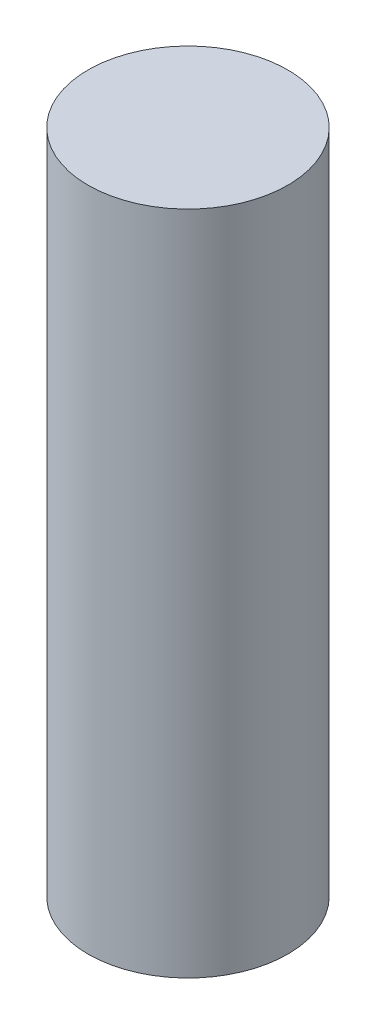
ISO-10303-21;
HEADER;
FILE_DESCRIPTION(('STEP AP214'),'2;1');
FILE_NAME('part.step','',(''),(''),'','','');
FILE_SCHEMA(('AUTOMOTIVE_DESIGN { 1 0 10303 214 1 1 1 1 }'));
ENDSEC;
DATA;
#1=APPLICATION_CONTEXT('core data for automotive mechanical design processes');
#2=APPLICATION_PROTOCOL_DEFINITION('international standard','automotive_design',2000,#1);
#3=PRODUCT_CONTEXT('',#1,'mechanical');
#4=PRODUCT('Part','Part','',(#3));
#5=PRODUCT_RELATED_PRODUCT_CATEGORY('part','',(#4));
#6=PRODUCT_DEFINITION_FORMATION('','',#4);
#7=PRODUCT_DEFINITION_CONTEXT('part definition',#1,'design');
#8=PRODUCT_DEFINITION('design','',#6,#7);
#9=PRODUCT_DEFINITION_SHAPE('','',#8);
#10=(LENGTH_UNIT() NAMED_UNIT(*) SI_UNIT(.MILLI.,.METRE.));
#11=(NAMED_UNIT(*) PLANE_ANGLE_UNIT() SI_UNIT($,.RADIAN.));
#12=(NAMED_UNIT(*) SI_UNIT($,.STERADIAN.) SOLID_ANGLE_UNIT());
#13=UNCERTAINTY_MEASURE_WITH_UNIT(LENGTH_MEASURE(1.E-05),#10,'distance_accuracy_value','');
#14=(GEOMETRIC_REPRESENTATION_CONTEXT(3) GLOBAL_UNCERTAINTY_ASSIGNED_CONTEXT((#13)) GLOBAL_UNIT_ASSIGNED_CONTEXT((#10,
#11,#12)) REPRESENTATION_CONTEXT('',''));
#15=CARTESIAN_POINT('',(0.,0.,0.));
#16=DIRECTION('',(0.,0.,1.));
#17=DIRECTION('',(1.,0.,0.));
#18=AXIS2_PLACEMENT_3D('',#15,#16,#17);
#19=CARTESIAN_POINT('',(0.,15.,0.));
#20=DIRECTION('',(0.,-1.,0.));
#21=DIRECTION('',(0.,0.,-1.));
#22=AXIS2_PLACEMENT_3D('',#19,#20,#21);
#23=CYLINDRICAL_SURFACE('',#22,2.25);
#24=CARTESIAN_POINT('',(0.,15.,0.));
#25=DIRECTION('',(0.,1.,0.));
#26=DIRECTION('',(0.,0.,1.));
#27=AXIS2_PLACEMENT_3D('',#24,#25,#26);
#28=CIRCLE('',#27,2.25);
#29=CARTESIAN_POINT('',(0.,15.,2.25));
#30=VERTEX_POINT('',#29);
#31=EDGE_CURVE('E10',#30,#30,#28,.T.);
#32=ORIENTED_EDGE('',*,*,#31,.F.);
#33=EDGE_LOOP('',(#32));
#34=FACE_BOUND('',#33,.T.);
#35=CARTESIAN_POINT('',(0.,0.,0.));
#36=DIRECTION('',(0.,1.,0.));
#37=DIRECTION('',(0.,0.,1.));
#38=AXIS2_PLACEMENT_3D('',#35,#36,#37);
#39=CIRCLE('',#38,2.25);
#40=CARTESIAN_POINT('',(0.,0.,2.25));
#41=VERTEX_POINT('',#40);
#42=EDGE_CURVE('E46',#41,#41,#39,.T.);
#43=ORIENTED_EDGE('',*,*,#42,.T.);
#44=EDGE_LOOP('',(#43));
#45=FACE_BOUND('',#44,.T.);
#46=ADVANCED_FACE('F43',(#34,#45),#23,.T.);
#47=CARTESIAN_POINT('',(0.,15.,0.));
#48=DIRECTION('',(0.,1.,0.));
#49=DIRECTION('',(0.,0.,1.));
#50=AXIS2_PLACEMENT_3D('',#47,#48,#49);
#51=PLANE('',#50);
#52=ORIENTED_EDGE('',*,*,#31,.T.);
#53=EDGE_LOOP('',(#52));
#54=FACE_BOUND('',#53,.T.);
#55=ADVANCED_FACE('F76',(#54),#51,.T.);
#56=CARTESIAN_POINT('',(0.,0.,0.));
#57=DIRECTION('',(0.,1.,0.));
#58=DIRECTION('',(0.,0.,1.));
#59=AXIS2_PLACEMENT_3D('',#56,#57,#58);
#60=PLANE('',#59);
#61=CARTESIAN_POINT('',(0.,0.,0.));
#62=DIRECTION('',(0.,-1.,0.));
#63=DIRECTION('',(0.,0.,-1.));
#64=AXIS2_PLACEMENT_3D('',#61,#62,#63);
#65=CIRCLE('',#64,2.);
#66=CARTESIAN_POINT('',(0.,0.,-2.));
#67=VERTEX_POINT('',#66);
#68=EDGE_CURVE('E57',#67,#67,#65,.T.);
#69=ORIENTED_EDGE('',*,*,#68,.F.);
#70=EDGE_LOOP('',(#69));
#71=FACE_BOUND('',#70,.T.);
#72=ORIENTED_EDGE('',*,*,#42,.F.);
#73=EDGE_LOOP('',(#72));
#74=FACE_BOUND('',#73,.T.);
#75=ADVANCED_FACE('F70',(#71,#74),#60,.F.);
#76=CARTESIAN_POINT('',(0.,3.,0.));
#77=DIRECTION('',(0.,-1.,0.));
#78=DIRECTION('',(0.,0.,-1.));
#79=AXIS2_PLACEMENT_3D('',#76,#77,#78);
#80=CYLINDRICAL_SURFACE('',#79,2.);
#81=CARTESIAN_POINT('',(0.,3.,0.));
#82=DIRECTION('',(0.,-1.,0.));
#83=DIRECTION('',(0.,0.,-1.));
#84=AXIS2_PLACEMENT_3D('',#81,#82,#83);
#85=CIRCLE('',#84,2.);
#86=CARTESIAN_POINT('',(0.,3.,-2.));
#87=VERTEX_POINT('',#86);
#88=EDGE_CURVE('E55',#87,#87,#85,.T.);
#89=ORIENTED_EDGE('',*,*,#88,.F.);
#90=EDGE_LOOP('',(#89));
#91=FACE_BOUND('',#90,.T.);
#92=ORIENTED_EDGE('',*,*,#68,.T.);
#93=EDGE_LOOP('',(#92));
#94=FACE_BOUND('',#93,.T.);
#95=ADVANCED_FACE('F67',(#91,#94),#80,.F.);
#96=CARTESIAN_POINT('',(0.,3.,0.));
#97=DIRECTION('',(0.,-1.,0.));
#98=DIRECTION('',(0.,0.,-1.));
#99=AXIS2_PLACEMENT_3D('',#96,#97,#98);
#100=PLANE('',#99);
#101=ORIENTED_EDGE('',*,*,#88,.T.);
#102=EDGE_LOOP('',(#101));
#103=FACE_BOUND('',#102,.T.);
#104=ADVANCED_FACE('F65',(#103),#100,.T.);
#105=CLOSED_SHELL('',(#46,#55,#75,#95,#104));
#106=MANIFOLD_SOLID_BREP('B2',#105);
#107=ADVANCED_BREP_SHAPE_REPRESENTATION('',(#18,#106),#14);
#108=SHAPE_DEFINITION_REPRESENTATION(#9,#107);
ENDSEC;
END-ISO-10303-21;
